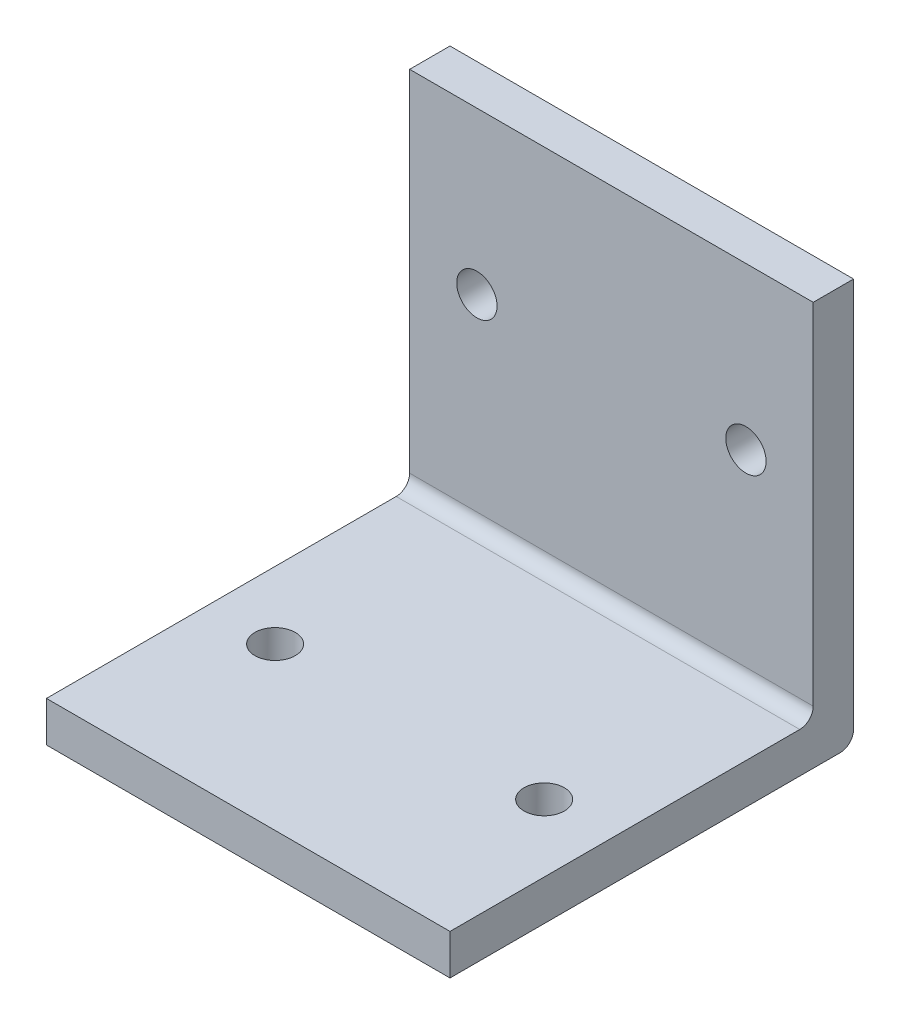
ISO-10303-21;
HEADER;
FILE_DESCRIPTION(('STEP AP214'),'2;1');
FILE_NAME('part.step','',(''),(''),'','','');
FILE_SCHEMA(('AUTOMOTIVE_DESIGN { 1 0 10303 214 1 1 1 1 }'));
ENDSEC;
DATA;
#1=APPLICATION_CONTEXT('core data for automotive mechanical design processes');
#2=APPLICATION_PROTOCOL_DEFINITION('international standard','automotive_design',2000,#1);
#3=PRODUCT_CONTEXT('',#1,'mechanical');
#4=PRODUCT('Part','Part','',(#3));
#5=PRODUCT_RELATED_PRODUCT_CATEGORY('part','',(#4));
#6=PRODUCT_DEFINITION_FORMATION('','',#4);
#7=PRODUCT_DEFINITION_CONTEXT('part definition',#1,'design');
#8=PRODUCT_DEFINITION('design','',#6,#7);
#9=PRODUCT_DEFINITION_SHAPE('','',#8);
#10=(LENGTH_UNIT() NAMED_UNIT(*) SI_UNIT(.MILLI.,.METRE.));
#11=(NAMED_UNIT(*) PLANE_ANGLE_UNIT() SI_UNIT($,.RADIAN.));
#12=(NAMED_UNIT(*) SI_UNIT($,.STERADIAN.) SOLID_ANGLE_UNIT());
#13=UNCERTAINTY_MEASURE_WITH_UNIT(LENGTH_MEASURE(1.E-05),#10,'distance_accuracy_value','');
#14=(GEOMETRIC_REPRESENTATION_CONTEXT(3) GLOBAL_UNCERTAINTY_ASSIGNED_CONTEXT((#13)) GLOBAL_UNIT_ASSIGNED_CONTEXT((#10,
#11,#12)) REPRESENTATION_CONTEXT('',''));
#15=CARTESIAN_POINT('',(0.,0.,0.));
#16=DIRECTION('',(0.,0.,1.));
#17=DIRECTION('',(1.,0.,0.));
#18=AXIS2_PLACEMENT_3D('',#15,#16,#17);
#19=CARTESIAN_POINT('',(-15.,-15.,3.));
#20=DIRECTION('',(1.,0.,0.));
#21=DIRECTION('',(0.,0.,-1.));
#22=AXIS2_PLACEMENT_3D('',#19,#20,#21);
#23=PLANE('',#22);
#24=DIRECTION('',(0.,-1.,0.));
#25=VECTOR('',#24,1.);
#26=CARTESIAN_POINT('',(-15.,-15.,0.));
#27=LINE('',#26,#25);
#28=CARTESIAN_POINT('',(-15.,15.,0.));
#29=VERTEX_POINT('',#28);
#30=CARTESIAN_POINT('',(-15.,-14.,0.));
#31=VERTEX_POINT('',#30);
#32=EDGE_CURVE('E173',#29,#31,#27,.T.);
#33=ORIENTED_EDGE('',*,*,#32,.T.);
#34=CARTESIAN_POINT('',(-15.,-14.,1.));
#35=DIRECTION('',(1.,0.,0.));
#36=DIRECTION('',(0.,0.,-1.));
#37=AXIS2_PLACEMENT_3D('',#34,#35,#36);
#38=CIRCLE('',#37,1.);
#39=CARTESIAN_POINT('',(-15.,-15.,1.));
#40=VERTEX_POINT('',#39);
#41=EDGE_CURVE('E11',#31,#40,#38,.F.);
#42=ORIENTED_EDGE('',*,*,#41,.T.);
#43=DIRECTION('',(0.,0.,-1.));
#44=VECTOR('',#43,1.);
#45=CARTESIAN_POINT('',(-15.,-15.,3.));
#46=LINE('',#45,#44);
#47=CARTESIAN_POINT('',(-15.,-15.,30.));
#48=VERTEX_POINT('',#47);
#49=EDGE_CURVE('E107',#48,#40,#46,.T.);
#50=ORIENTED_EDGE('',*,*,#49,.F.);
#51=DIRECTION('',(0.,-1.,0.));
#52=VECTOR('',#51,1.);
#53=CARTESIAN_POINT('',(-15.,-15.,30.));
#54=LINE('',#53,#52);
#55=CARTESIAN_POINT('',(-15.,-12.,30.));
#56=VERTEX_POINT('',#55);
#57=EDGE_CURVE('E111',#56,#48,#54,.T.);
#58=ORIENTED_EDGE('',*,*,#57,.F.);
#59=DIRECTION('',(0.,0.,-1.));
#60=VECTOR('',#59,1.);
#61=CARTESIAN_POINT('',(-15.,-12.,30.));
#62=LINE('',#61,#60);
#63=CARTESIAN_POINT('',(-15.,-12.,4.));
#64=VERTEX_POINT('',#63);
#65=EDGE_CURVE('E145',#56,#64,#62,.T.);
#66=ORIENTED_EDGE('',*,*,#65,.T.);
#67=CARTESIAN_POINT('',(-15.,-11.,4.));
#68=DIRECTION('',(1.,0.,0.));
#69=DIRECTION('',(0.,0.,-1.));
#70=AXIS2_PLACEMENT_3D('',#67,#68,#69);
#71=CIRCLE('',#70,1.);
#72=CARTESIAN_POINT('',(-15.,-11.,3.));
#73=VERTEX_POINT('',#72);
#74=EDGE_CURVE('E203',#64,#73,#71,.T.);
#75=ORIENTED_EDGE('',*,*,#74,.T.);
#76=DIRECTION('',(0.,-1.,0.));
#77=VECTOR('',#76,1.);
#78=CARTESIAN_POINT('',(-15.,-15.,3.));
#79=LINE('',#78,#77);
#80=CARTESIAN_POINT('',(-15.,15.,3.));
#81=VERTEX_POINT('',#80);
#82=EDGE_CURVE('E161',#81,#73,#79,.T.);
#83=ORIENTED_EDGE('',*,*,#82,.F.);
#84=DIRECTION('',(0.,0.,-1.));
#85=VECTOR('',#84,1.);
#86=CARTESIAN_POINT('',(-15.,15.,3.));
#87=LINE('',#86,#85);
#88=EDGE_CURVE('E172',#81,#29,#87,.T.);
#89=ORIENTED_EDGE('',*,*,#88,.T.);
#90=EDGE_LOOP('',(#33,#42,#50,#58,#66,#75,#83,#89));
#91=FACE_BOUND('',#90,.T.);
#92=ADVANCED_FACE('F42',(#91),#23,.F.);
#93=CARTESIAN_POINT('',(15.,-15.,3.));
#94=DIRECTION('',(0.,1.,0.));
#95=DIRECTION('',(-1.,0.,0.));
#96=AXIS2_PLACEMENT_3D('',#93,#94,#95);
#97=PLANE('',#96);
#98=CARTESIAN_POINT('',(10.,-15.,18.));
#99=DIRECTION('',(0.,1.,0.));
#100=DIRECTION('',(-1.,0.,0.));
#101=AXIS2_PLACEMENT_3D('',#98,#99,#100);
#102=CIRCLE('',#101,1.5);
#103=CARTESIAN_POINT('',(8.5,-15.,18.));
#104=VERTEX_POINT('',#103);
#105=EDGE_CURVE('E133',#104,#104,#102,.T.);
#106=ORIENTED_EDGE('',*,*,#105,.T.);
#107=EDGE_LOOP('',(#106));
#108=FACE_BOUND('',#107,.T.);
#109=CARTESIAN_POINT('',(-10.,-15.,18.));
#110=DIRECTION('',(0.,1.,0.));
#111=DIRECTION('',(-1.,0.,0.));
#112=AXIS2_PLACEMENT_3D('',#109,#110,#111);
#113=CIRCLE('',#112,1.5);
#114=CARTESIAN_POINT('',(-11.5,-15.,18.));
#115=VERTEX_POINT('',#114);
#116=EDGE_CURVE('E137',#115,#115,#113,.T.);
#117=ORIENTED_EDGE('',*,*,#116,.T.);
#118=EDGE_LOOP('',(#117));
#119=FACE_BOUND('',#118,.T.);
#120=ORIENTED_EDGE('',*,*,#49,.T.);
#121=DIRECTION('',(1.,0.,0.));
#122=VECTOR('',#121,1.);
#123=CARTESIAN_POINT('',(15.,-15.,1.));
#124=LINE('',#123,#122);
#125=CARTESIAN_POINT('',(15.,-15.,1.));
#126=VERTEX_POINT('',#125);
#127=EDGE_CURVE('E209',#40,#126,#124,.T.);
#128=ORIENTED_EDGE('',*,*,#127,.T.);
#129=DIRECTION('',(0.,0.,-1.));
#130=VECTOR('',#129,1.);
#131=CARTESIAN_POINT('',(15.,-15.,3.));
#132=LINE('',#131,#130);
#133=CARTESIAN_POINT('',(15.,-15.,30.));
#134=VERTEX_POINT('',#133);
#135=EDGE_CURVE('E118',#134,#126,#132,.T.);
#136=ORIENTED_EDGE('',*,*,#135,.F.);
#137=DIRECTION('',(1.,0.,0.));
#138=VECTOR('',#137,1.);
#139=CARTESIAN_POINT('',(-15.,-15.,30.));
#140=LINE('',#139,#138);
#141=EDGE_CURVE('E121',#48,#134,#140,.T.);
#142=ORIENTED_EDGE('',*,*,#141,.F.);
#143=EDGE_LOOP('',(#120,#128,#136,#142));
#144=FACE_BOUND('',#143,.T.);
#145=ADVANCED_FACE('F122',(#108,#119,#144),#97,.F.);
#146=CARTESIAN_POINT('',(15.,-15.,3.));
#147=DIRECTION('',(-1.,0.,0.));
#148=DIRECTION('',(0.,-1.,0.));
#149=AXIS2_PLACEMENT_3D('',#146,#147,#148);
#150=PLANE('',#149);
#151=ORIENTED_EDGE('',*,*,#135,.T.);
#152=CARTESIAN_POINT('',(15.,-14.,1.));
#153=DIRECTION('',(-1.,0.,0.));
#154=DIRECTION('',(0.,-1.,0.));
#155=AXIS2_PLACEMENT_3D('',#152,#153,#154);
#156=CIRCLE('',#155,1.);
#157=CARTESIAN_POINT('',(15.,-14.,0.));
#158=VERTEX_POINT('',#157);
#159=EDGE_CURVE('E65',#126,#158,#156,.F.);
#160=ORIENTED_EDGE('',*,*,#159,.T.);
#161=DIRECTION('',(0.,1.,0.));
#162=VECTOR('',#161,1.);
#163=CARTESIAN_POINT('',(15.,-15.,0.));
#164=LINE('',#163,#162);
#165=CARTESIAN_POINT('',(15.,15.,0.));
#166=VERTEX_POINT('',#165);
#167=EDGE_CURVE('E176',#158,#166,#164,.T.);
#168=ORIENTED_EDGE('',*,*,#167,.T.);
#169=DIRECTION('',(0.,0.,-1.));
#170=VECTOR('',#169,1.);
#171=CARTESIAN_POINT('',(15.,15.,3.));
#172=LINE('',#171,#170);
#173=CARTESIAN_POINT('',(15.,15.,3.));
#174=VERTEX_POINT('',#173);
#175=EDGE_CURVE('E185',#174,#166,#172,.T.);
#176=ORIENTED_EDGE('',*,*,#175,.F.);
#177=DIRECTION('',(0.,1.,0.));
#178=VECTOR('',#177,1.);
#179=CARTESIAN_POINT('',(15.,-15.,3.));
#180=LINE('',#179,#178);
#181=CARTESIAN_POINT('',(15.,-11.,3.));
#182=VERTEX_POINT('',#181);
#183=EDGE_CURVE('E165',#182,#174,#180,.T.);
#184=ORIENTED_EDGE('',*,*,#183,.F.);
#185=CARTESIAN_POINT('',(15.,-11.,4.));
#186=DIRECTION('',(-1.,0.,0.));
#187=DIRECTION('',(0.,-1.,0.));
#188=AXIS2_PLACEMENT_3D('',#185,#186,#187);
#189=CIRCLE('',#188,1.);
#190=CARTESIAN_POINT('',(15.,-12.,4.));
#191=VERTEX_POINT('',#190);
#192=EDGE_CURVE('E206',#182,#191,#189,.T.);
#193=ORIENTED_EDGE('',*,*,#192,.T.);
#194=DIRECTION('',(0.,0.,-1.));
#195=VECTOR('',#194,1.);
#196=CARTESIAN_POINT('',(15.,-12.,30.));
#197=LINE('',#196,#195);
#198=CARTESIAN_POINT('',(15.,-12.,30.));
#199=VERTEX_POINT('',#198);
#200=EDGE_CURVE('E148',#199,#191,#197,.T.);
#201=ORIENTED_EDGE('',*,*,#200,.F.);
#202=DIRECTION('',(0.,1.,0.));
#203=VECTOR('',#202,1.);
#204=CARTESIAN_POINT('',(15.,-15.,30.));
#205=LINE('',#204,#203);
#206=EDGE_CURVE('E126',#134,#199,#205,.T.);
#207=ORIENTED_EDGE('',*,*,#206,.F.);
#208=EDGE_LOOP('',(#151,#160,#168,#176,#184,#193,#201,#207));
#209=FACE_BOUND('',#208,.T.);
#210=ADVANCED_FACE('F215',(#209),#150,.F.);
#211=CARTESIAN_POINT('',(15.,15.,3.));
#212=DIRECTION('',(0.,-1.,0.));
#213=DIRECTION('',(0.,0.,-1.));
#214=AXIS2_PLACEMENT_3D('',#211,#212,#213);
#215=PLANE('',#214);
#216=DIRECTION('',(-1.,0.,0.));
#217=VECTOR('',#216,1.);
#218=CARTESIAN_POINT('',(15.,15.,0.));
#219=LINE('',#218,#217);
#220=EDGE_CURVE('E166',#166,#29,#219,.T.);
#221=ORIENTED_EDGE('',*,*,#220,.T.);
#222=ORIENTED_EDGE('',*,*,#88,.F.);
#223=DIRECTION('',(-1.,0.,0.));
#224=VECTOR('',#223,1.);
#225=CARTESIAN_POINT('',(15.,15.,3.));
#226=LINE('',#225,#224);
#227=EDGE_CURVE('E169',#174,#81,#226,.T.);
#228=ORIENTED_EDGE('',*,*,#227,.F.);
#229=ORIENTED_EDGE('',*,*,#175,.T.);
#230=EDGE_LOOP('',(#221,#222,#228,#229));
#231=FACE_BOUND('',#230,.T.);
#232=ADVANCED_FACE('F250',(#231),#215,.F.);
#233=CARTESIAN_POINT('',(0.,0.,3.));
#234=DIRECTION('',(0.,0.,1.));
#235=DIRECTION('',(1.,0.,0.));
#236=AXIS2_PLACEMENT_3D('',#233,#234,#235);
#237=PLANE('',#236);
#238=ORIENTED_EDGE('',*,*,#82,.T.);
#239=DIRECTION('',(-1.,0.,0.));
#240=VECTOR('',#239,1.);
#241=CARTESIAN_POINT('',(0.,-11.,3.));
#242=LINE('',#241,#240);
#243=EDGE_CURVE('E200',#73,#182,#242,.F.);
#244=ORIENTED_EDGE('',*,*,#243,.T.);
#245=ORIENTED_EDGE('',*,*,#183,.T.);
#246=ORIENTED_EDGE('',*,*,#227,.T.);
#247=EDGE_LOOP('',(#238,#244,#245,#246));
#248=FACE_BOUND('',#247,.T.);
#249=CARTESIAN_POINT('',(10.,3.,3.));
#250=DIRECTION('',(0.,0.,1.));
#251=DIRECTION('',(1.,0.,0.));
#252=AXIS2_PLACEMENT_3D('',#249,#250,#251);
#253=CIRCLE('',#252,1.5);
#254=CARTESIAN_POINT('',(11.5,3.,3.));
#255=VERTEX_POINT('',#254);
#256=EDGE_CURVE('E153',#255,#255,#253,.T.);
#257=ORIENTED_EDGE('',*,*,#256,.F.);
#258=EDGE_LOOP('',(#257));
#259=FACE_BOUND('',#258,.T.);
#260=CARTESIAN_POINT('',(-10.,3.,3.));
#261=DIRECTION('',(0.,0.,1.));
#262=DIRECTION('',(1.,0.,0.));
#263=AXIS2_PLACEMENT_3D('',#260,#261,#262);
#264=CIRCLE('',#263,1.5);
#265=CARTESIAN_POINT('',(-8.5,3.,3.));
#266=VERTEX_POINT('',#265);
#267=EDGE_CURVE('E152',#266,#266,#264,.T.);
#268=ORIENTED_EDGE('',*,*,#267,.F.);
#269=EDGE_LOOP('',(#268));
#270=FACE_BOUND('',#269,.T.);
#271=ADVANCED_FACE('F226',(#248,#259,#270),#237,.T.);
#272=CARTESIAN_POINT('',(0.,0.,0.));
#273=DIRECTION('',(0.,0.,1.));
#274=DIRECTION('',(1.,0.,0.));
#275=AXIS2_PLACEMENT_3D('',#272,#273,#274);
#276=PLANE('',#275);
#277=CARTESIAN_POINT('',(10.,3.,0.));
#278=DIRECTION('',(0.,0.,1.));
#279=DIRECTION('',(1.,0.,0.));
#280=AXIS2_PLACEMENT_3D('',#277,#278,#279);
#281=CIRCLE('',#280,1.5);
#282=CARTESIAN_POINT('',(11.5,3.,0.));
#283=VERTEX_POINT('',#282);
#284=EDGE_CURVE('E177',#283,#283,#281,.T.);
#285=ORIENTED_EDGE('',*,*,#284,.T.);
#286=EDGE_LOOP('',(#285));
#287=FACE_BOUND('',#286,.T.);
#288=CARTESIAN_POINT('',(-10.,3.,0.));
#289=DIRECTION('',(0.,0.,1.));
#290=DIRECTION('',(1.,0.,0.));
#291=AXIS2_PLACEMENT_3D('',#288,#289,#290);
#292=CIRCLE('',#291,1.5);
#293=CARTESIAN_POINT('',(-8.5,3.,0.));
#294=VERTEX_POINT('',#293);
#295=EDGE_CURVE('E157',#294,#294,#292,.T.);
#296=ORIENTED_EDGE('',*,*,#295,.T.);
#297=EDGE_LOOP('',(#296));
#298=FACE_BOUND('',#297,.T.);
#299=ORIENTED_EDGE('',*,*,#167,.F.);
#300=DIRECTION('',(1.,0.,0.));
#301=VECTOR('',#300,1.);
#302=CARTESIAN_POINT('',(0.,-14.,0.));
#303=LINE('',#302,#301);
#304=EDGE_CURVE('E51',#158,#31,#303,.F.);
#305=ORIENTED_EDGE('',*,*,#304,.T.);
#306=ORIENTED_EDGE('',*,*,#32,.F.);
#307=ORIENTED_EDGE('',*,*,#220,.F.);
#308=EDGE_LOOP('',(#299,#305,#306,#307));
#309=FACE_BOUND('',#308,.T.);
#310=ADVANCED_FACE('F254',(#287,#298,#309),#276,.F.);
#311=CARTESIAN_POINT('',(-10.,3.,-0.5));
#312=DIRECTION('',(0.,0.,1.));
#313=DIRECTION('',(1.,0.,0.));
#314=AXIS2_PLACEMENT_3D('',#311,#312,#313);
#315=CYLINDRICAL_SURFACE('',#314,1.5);
#316=ORIENTED_EDGE('',*,*,#267,.T.);
#317=EDGE_LOOP('',(#316));
#318=FACE_BOUND('',#317,.T.);
#319=ORIENTED_EDGE('',*,*,#295,.F.);
#320=EDGE_LOOP('',(#319));
#321=FACE_BOUND('',#320,.T.);
#322=ADVANCED_FACE('F257',(#318,#321),#315,.F.);
#323=CARTESIAN_POINT('',(10.,3.,-0.5));
#324=DIRECTION('',(0.,0.,1.));
#325=DIRECTION('',(1.,0.,0.));
#326=AXIS2_PLACEMENT_3D('',#323,#324,#325);
#327=CYLINDRICAL_SURFACE('',#326,1.5);
#328=ORIENTED_EDGE('',*,*,#256,.T.);
#329=EDGE_LOOP('',(#328));
#330=FACE_BOUND('',#329,.T.);
#331=ORIENTED_EDGE('',*,*,#284,.F.);
#332=EDGE_LOOP('',(#331));
#333=FACE_BOUND('',#332,.T.);
#334=ADVANCED_FACE('F263',(#330,#333),#327,.F.);
#335=CARTESIAN_POINT('',(-15.,-12.,30.));
#336=DIRECTION('',(0.,-1.,0.));
#337=DIRECTION('',(0.,0.,-1.));
#338=AXIS2_PLACEMENT_3D('',#335,#336,#337);
#339=PLANE('',#338);
#340=CARTESIAN_POINT('',(10.,-12.,18.));
#341=DIRECTION('',(0.,1.,0.));
#342=DIRECTION('',(0.,0.,1.));
#343=AXIS2_PLACEMENT_3D('',#340,#341,#342);
#344=CIRCLE('',#343,1.5);
#345=CARTESIAN_POINT('',(10.,-12.,19.5));
#346=VERTEX_POINT('',#345);
#347=EDGE_CURVE('E285',#346,#346,#344,.T.);
#348=ORIENTED_EDGE('',*,*,#347,.F.);
#349=EDGE_LOOP('',(#348));
#350=FACE_BOUND('',#349,.T.);
#351=CARTESIAN_POINT('',(-10.,-12.,18.));
#352=DIRECTION('',(0.,1.,0.));
#353=DIRECTION('',(0.,0.,1.));
#354=AXIS2_PLACEMENT_3D('',#351,#352,#353);
#355=CIRCLE('',#354,1.5);
#356=CARTESIAN_POINT('',(-10.,-12.,19.5));
#357=VERTEX_POINT('',#356);
#358=EDGE_CURVE('E280',#357,#357,#355,.T.);
#359=ORIENTED_EDGE('',*,*,#358,.F.);
#360=EDGE_LOOP('',(#359));
#361=FACE_BOUND('',#360,.T.);
#362=ORIENTED_EDGE('',*,*,#200,.T.);
#363=DIRECTION('',(-1.,0.,0.));
#364=VECTOR('',#363,1.);
#365=CARTESIAN_POINT('',(-15.,-12.,4.));
#366=LINE('',#365,#364);
#367=EDGE_CURVE('E117',#191,#64,#366,.T.);
#368=ORIENTED_EDGE('',*,*,#367,.T.);
#369=ORIENTED_EDGE('',*,*,#65,.F.);
#370=DIRECTION('',(-1.,0.,0.));
#371=VECTOR('',#370,1.);
#372=CARTESIAN_POINT('',(-15.,-12.,30.));
#373=LINE('',#372,#371);
#374=EDGE_CURVE('E130',#199,#56,#373,.T.);
#375=ORIENTED_EDGE('',*,*,#374,.F.);
#376=EDGE_LOOP('',(#362,#368,#369,#375));
#377=FACE_BOUND('',#376,.T.);
#378=ADVANCED_FACE('F221',(#350,#361,#377),#339,.F.);
#379=CARTESIAN_POINT('',(0.,0.,30.));
#380=DIRECTION('',(0.,0.,-1.));
#381=DIRECTION('',(-1.,0.,0.));
#382=AXIS2_PLACEMENT_3D('',#379,#380,#381);
#383=PLANE('',#382);
#384=ORIENTED_EDGE('',*,*,#57,.T.);
#385=ORIENTED_EDGE('',*,*,#141,.T.);
#386=ORIENTED_EDGE('',*,*,#206,.T.);
#387=ORIENTED_EDGE('',*,*,#374,.T.);
#388=EDGE_LOOP('',(#384,#385,#386,#387));
#389=FACE_BOUND('',#388,.T.);
#390=ADVANCED_FACE('F128',(#389),#383,.F.);
#391=CARTESIAN_POINT('',(-10.,-39.,18.));
#392=DIRECTION('',(0.,1.,0.));
#393=DIRECTION('',(0.,0.,1.));
#394=AXIS2_PLACEMENT_3D('',#391,#392,#393);
#395=CYLINDRICAL_SURFACE('',#394,1.5);
#396=ORIENTED_EDGE('',*,*,#358,.T.);
#397=EDGE_LOOP('',(#396));
#398=FACE_BOUND('',#397,.T.);
#399=ORIENTED_EDGE('',*,*,#116,.F.);
#400=EDGE_LOOP('',(#399));
#401=FACE_BOUND('',#400,.T.);
#402=ADVANCED_FACE('F237',(#398,#401),#395,.F.);
#403=CARTESIAN_POINT('',(10.,-39.,18.));
#404=DIRECTION('',(0.,1.,0.));
#405=DIRECTION('',(0.,0.,1.));
#406=AXIS2_PLACEMENT_3D('',#403,#404,#405);
#407=CYLINDRICAL_SURFACE('',#406,1.5);
#408=ORIENTED_EDGE('',*,*,#347,.T.);
#409=EDGE_LOOP('',(#408));
#410=FACE_BOUND('',#409,.T.);
#411=ORIENTED_EDGE('',*,*,#105,.F.);
#412=EDGE_LOOP('',(#411));
#413=FACE_BOUND('',#412,.T.);
#414=ADVANCED_FACE('F232',(#410,#413),#407,.F.);
#415=CARTESIAN_POINT('',(-15.,-11.,4.));
#416=DIRECTION('',(-1.,0.,0.));
#417=DIRECTION('',(0.,0.,1.));
#418=AXIS2_PLACEMENT_3D('',#415,#416,#417);
#419=CYLINDRICAL_SURFACE('',#418,1.);
#420=ORIENTED_EDGE('',*,*,#192,.F.);
#421=ORIENTED_EDGE('',*,*,#243,.F.);
#422=ORIENTED_EDGE('',*,*,#74,.F.);
#423=ORIENTED_EDGE('',*,*,#367,.F.);
#424=EDGE_LOOP('',(#420,#421,#422,#423));
#425=FACE_BOUND('',#424,.T.);
#426=ADVANCED_FACE('F230',(#425),#419,.F.);
#427=CARTESIAN_POINT('',(15.,-14.,1.));
#428=DIRECTION('',(1.,0.,0.));
#429=DIRECTION('',(0.,1.,0.));
#430=AXIS2_PLACEMENT_3D('',#427,#428,#429);
#431=CYLINDRICAL_SURFACE('',#430,1.);
#432=ORIENTED_EDGE('',*,*,#41,.F.);
#433=ORIENTED_EDGE('',*,*,#304,.F.);
#434=ORIENTED_EDGE('',*,*,#159,.F.);
#435=ORIENTED_EDGE('',*,*,#127,.F.);
#436=EDGE_LOOP('',(#432,#433,#434,#435));
#437=FACE_BOUND('',#436,.T.);
#438=ADVANCED_FACE('F44',(#437),#431,.T.);
#439=CLOSED_SHELL('',(#92,#145,#210,#232,#271,#310,#322,#334,#378,#390,#402,#414,#426,#438));
#440=MANIFOLD_SOLID_BREP('B2',#439);
#441=ADVANCED_BREP_SHAPE_REPRESENTATION('',(#18,#440),#14);
#442=SHAPE_DEFINITION_REPRESENTATION(#9,#441);
ENDSEC;
END-ISO-10303-21;
